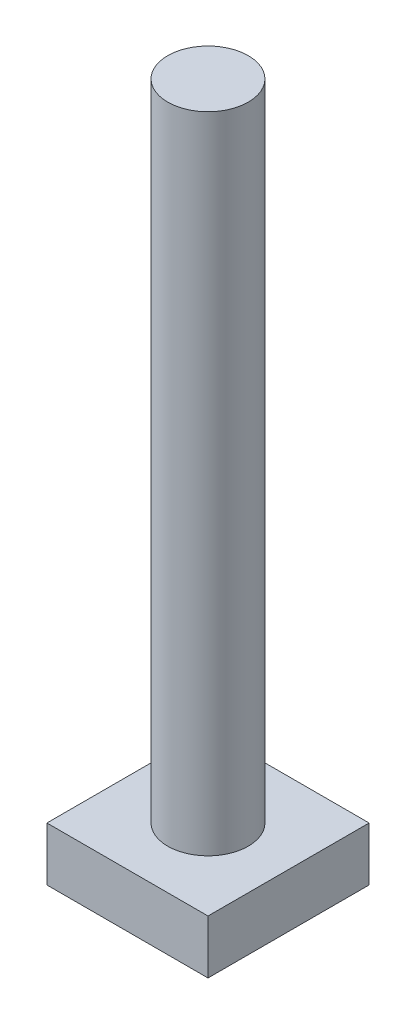
ISO-10303-21;
HEADER;
FILE_DESCRIPTION(('STEP AP214'),'2;1');
FILE_NAME('part.step','',(''),(''),'','','');
FILE_SCHEMA(('AUTOMOTIVE_DESIGN { 1 0 10303 214 1 1 1 1 }'));
ENDSEC;
DATA;
#1=APPLICATION_CONTEXT('core data for automotive mechanical design processes');
#2=APPLICATION_PROTOCOL_DEFINITION('international standard','automotive_design',2000,#1);
#3=PRODUCT_CONTEXT('',#1,'mechanical');
#4=PRODUCT('Part','Part','',(#3));
#5=PRODUCT_RELATED_PRODUCT_CATEGORY('part','',(#4));
#6=PRODUCT_DEFINITION_FORMATION('','',#4);
#7=PRODUCT_DEFINITION_CONTEXT('part definition',#1,'design');
#8=PRODUCT_DEFINITION('design','',#6,#7);
#9=PRODUCT_DEFINITION_SHAPE('','',#8);
#10=(LENGTH_UNIT() NAMED_UNIT(*) SI_UNIT(.MILLI.,.METRE.));
#11=(NAMED_UNIT(*) PLANE_ANGLE_UNIT() SI_UNIT($,.RADIAN.));
#12=(NAMED_UNIT(*) SI_UNIT($,.STERADIAN.) SOLID_ANGLE_UNIT());
#13=UNCERTAINTY_MEASURE_WITH_UNIT(LENGTH_MEASURE(1.E-05),#10,'distance_accuracy_value','');
#14=(GEOMETRIC_REPRESENTATION_CONTEXT(3) GLOBAL_UNCERTAINTY_ASSIGNED_CONTEXT((#13)) GLOBAL_UNIT_ASSIGNED_CONTEXT((#10,
#11,#12)) REPRESENTATION_CONTEXT('',''));
#15=CARTESIAN_POINT('',(0.,0.,0.));
#16=DIRECTION('',(0.,0.,1.));
#17=DIRECTION('',(1.,0.,0.));
#18=AXIS2_PLACEMENT_3D('',#15,#16,#17);
#19=CARTESIAN_POINT('',(12.,4.,-12.));
#20=DIRECTION('',(-1.,0.,0.));
#21=DIRECTION('',(0.,0.,1.));
#22=AXIS2_PLACEMENT_3D('',#19,#20,#21);
#23=PLANE('',#22);
#24=DIRECTION('',(0.,0.,-1.));
#25=VECTOR('',#24,1.);
#26=CARTESIAN_POINT('',(12.,-4.,-12.));
#27=LINE('',#26,#25);
#28=CARTESIAN_POINT('',(12.,-4.,12.));
#29=VERTEX_POINT('',#28);
#30=CARTESIAN_POINT('',(12.,-4.,-12.));
#31=VERTEX_POINT('',#30);
#32=EDGE_CURVE('E103',#29,#31,#27,.T.);
#33=ORIENTED_EDGE('',*,*,#32,.T.);
#34=DIRECTION('',(0.,-1.,0.));
#35=VECTOR('',#34,1.);
#36=CARTESIAN_POINT('',(12.,4.,-12.));
#37=LINE('',#36,#35);
#38=CARTESIAN_POINT('',(12.,4.,-12.));
#39=VERTEX_POINT('',#38);
#40=EDGE_CURVE('E40',#39,#31,#37,.T.);
#41=ORIENTED_EDGE('',*,*,#40,.F.);
#42=DIRECTION('',(0.,0.,-1.));
#43=VECTOR('',#42,1.);
#44=CARTESIAN_POINT('',(12.,4.,-12.));
#45=LINE('',#44,#43);
#46=CARTESIAN_POINT('',(12.,4.,12.));
#47=VERTEX_POINT('',#46);
#48=EDGE_CURVE('E90',#47,#39,#45,.T.);
#49=ORIENTED_EDGE('',*,*,#48,.F.);
#50=DIRECTION('',(0.,-1.,0.));
#51=VECTOR('',#50,1.);
#52=CARTESIAN_POINT('',(12.,4.,12.));
#53=LINE('',#52,#51);
#54=EDGE_CURVE('E99',#47,#29,#53,.T.);
#55=ORIENTED_EDGE('',*,*,#54,.T.);
#56=EDGE_LOOP('',(#33,#41,#49,#55));
#57=FACE_BOUND('',#56,.T.);
#58=ADVANCED_FACE('F37',(#57),#23,.F.);
#59=CARTESIAN_POINT('',(-12.,4.,-12.));
#60=DIRECTION('',(0.,0.,1.));
#61=DIRECTION('',(1.,0.,0.));
#62=AXIS2_PLACEMENT_3D('',#59,#60,#61);
#63=PLANE('',#62);
#64=DIRECTION('',(-1.,0.,0.));
#65=VECTOR('',#64,1.);
#66=CARTESIAN_POINT('',(-12.,-4.,-12.));
#67=LINE('',#66,#65);
#68=CARTESIAN_POINT('',(-12.,-4.,-12.));
#69=VERTEX_POINT('',#68);
#70=EDGE_CURVE('E95',#31,#69,#67,.T.);
#71=ORIENTED_EDGE('',*,*,#70,.T.);
#72=DIRECTION('',(0.,-1.,0.));
#73=VECTOR('',#72,1.);
#74=CARTESIAN_POINT('',(-12.,4.,-12.));
#75=LINE('',#74,#73);
#76=CARTESIAN_POINT('',(-12.,4.,-12.));
#77=VERTEX_POINT('',#76);
#78=EDGE_CURVE('E93',#77,#69,#75,.T.);
#79=ORIENTED_EDGE('',*,*,#78,.F.);
#80=DIRECTION('',(-1.,0.,0.));
#81=VECTOR('',#80,1.);
#82=CARTESIAN_POINT('',(-12.,4.,-12.));
#83=LINE('',#82,#81);
#84=EDGE_CURVE('E85',#39,#77,#83,.T.);
#85=ORIENTED_EDGE('',*,*,#84,.F.);
#86=ORIENTED_EDGE('',*,*,#40,.T.);
#87=EDGE_LOOP('',(#71,#79,#85,#86));
#88=FACE_BOUND('',#87,.T.);
#89=ADVANCED_FACE('F94',(#88),#63,.F.);
#90=CARTESIAN_POINT('',(-12.,4.,-12.));
#91=DIRECTION('',(1.,0.,0.));
#92=DIRECTION('',(0.,0.,-1.));
#93=AXIS2_PLACEMENT_3D('',#90,#91,#92);
#94=PLANE('',#93);
#95=DIRECTION('',(0.,0.,1.));
#96=VECTOR('',#95,1.);
#97=CARTESIAN_POINT('',(-12.,-4.,-12.));
#98=LINE('',#97,#96);
#99=CARTESIAN_POINT('',(-12.,-4.,12.));
#100=VERTEX_POINT('',#99);
#101=EDGE_CURVE('E71',#69,#100,#98,.T.);
#102=ORIENTED_EDGE('',*,*,#101,.T.);
#103=DIRECTION('',(0.,-1.,0.));
#104=VECTOR('',#103,1.);
#105=CARTESIAN_POINT('',(-12.,4.,12.));
#106=LINE('',#105,#104);
#107=CARTESIAN_POINT('',(-12.,4.,12.));
#108=VERTEX_POINT('',#107);
#109=EDGE_CURVE('E96',#108,#100,#106,.T.);
#110=ORIENTED_EDGE('',*,*,#109,.F.);
#111=DIRECTION('',(0.,0.,1.));
#112=VECTOR('',#111,1.);
#113=CARTESIAN_POINT('',(-12.,4.,-12.));
#114=LINE('',#113,#112);
#115=EDGE_CURVE('E88',#77,#108,#114,.T.);
#116=ORIENTED_EDGE('',*,*,#115,.F.);
#117=ORIENTED_EDGE('',*,*,#78,.T.);
#118=EDGE_LOOP('',(#102,#110,#116,#117));
#119=FACE_BOUND('',#118,.T.);
#120=ADVANCED_FACE('F97',(#119),#94,.F.);
#121=CARTESIAN_POINT('',(-12.,4.,12.));
#122=DIRECTION('',(0.,0.,-1.));
#123=DIRECTION('',(-1.,0.,0.));
#124=AXIS2_PLACEMENT_3D('',#121,#122,#123);
#125=PLANE('',#124);
#126=DIRECTION('',(1.,0.,0.));
#127=VECTOR('',#126,1.);
#128=CARTESIAN_POINT('',(-12.,-4.,12.));
#129=LINE('',#128,#127);
#130=EDGE_CURVE('E77',#100,#29,#129,.T.);
#131=ORIENTED_EDGE('',*,*,#130,.T.);
#132=ORIENTED_EDGE('',*,*,#54,.F.);
#133=DIRECTION('',(1.,0.,0.));
#134=VECTOR('',#133,1.);
#135=CARTESIAN_POINT('',(-12.,4.,12.));
#136=LINE('',#135,#134);
#137=EDGE_CURVE('E54',#108,#47,#136,.T.);
#138=ORIENTED_EDGE('',*,*,#137,.F.);
#139=ORIENTED_EDGE('',*,*,#109,.T.);
#140=EDGE_LOOP('',(#131,#132,#138,#139));
#141=FACE_BOUND('',#140,.T.);
#142=ADVANCED_FACE('F111',(#141),#125,.F.);
#143=CARTESIAN_POINT('',(0.,4.,0.));
#144=DIRECTION('',(0.,1.,0.));
#145=DIRECTION('',(0.,0.,1.));
#146=AXIS2_PLACEMENT_3D('',#143,#144,#145);
#147=PLANE('',#146);
#148=CARTESIAN_POINT('',(0.,4.,0.));
#149=DIRECTION('',(0.,1.,0.));
#150=DIRECTION('',(0.,0.,1.));
#151=AXIS2_PLACEMENT_3D('',#148,#149,#150);
#152=CIRCLE('',#151,6.);
#153=CARTESIAN_POINT('',(0.,4.,6.));
#154=VERTEX_POINT('',#153);
#155=EDGE_CURVE('E11',#154,#154,#152,.T.);
#156=ORIENTED_EDGE('',*,*,#155,.F.);
#157=EDGE_LOOP('',(#156));
#158=FACE_BOUND('',#157,.T.);
#159=ORIENTED_EDGE('',*,*,#48,.T.);
#160=ORIENTED_EDGE('',*,*,#84,.T.);
#161=ORIENTED_EDGE('',*,*,#115,.T.);
#162=ORIENTED_EDGE('',*,*,#137,.T.);
#163=EDGE_LOOP('',(#159,#160,#161,#162));
#164=FACE_BOUND('',#163,.T.);
#165=ADVANCED_FACE('F86',(#158,#164),#147,.T.);
#166=CARTESIAN_POINT('',(0.,-4.,0.));
#167=DIRECTION('',(0.,1.,0.));
#168=DIRECTION('',(0.,0.,1.));
#169=AXIS2_PLACEMENT_3D('',#166,#167,#168);
#170=PLANE('',#169);
#171=ORIENTED_EDGE('',*,*,#32,.F.);
#172=ORIENTED_EDGE('',*,*,#130,.F.);
#173=ORIENTED_EDGE('',*,*,#101,.F.);
#174=ORIENTED_EDGE('',*,*,#70,.F.);
#175=EDGE_LOOP('',(#171,#172,#173,#174));
#176=FACE_BOUND('',#175,.T.);
#177=ADVANCED_FACE('F114',(#176),#170,.F.);
#178=CARTESIAN_POINT('',(0.,100.,0.));
#179=DIRECTION('',(0.,-1.,0.));
#180=DIRECTION('',(0.,0.,-1.));
#181=AXIS2_PLACEMENT_3D('',#178,#179,#180);
#182=CYLINDRICAL_SURFACE('',#181,6.);
#183=CARTESIAN_POINT('',(0.,100.,0.));
#184=DIRECTION('',(0.,1.,0.));
#185=DIRECTION('',(0.,0.,1.));
#186=AXIS2_PLACEMENT_3D('',#183,#184,#185);
#187=CIRCLE('',#186,6.);
#188=CARTESIAN_POINT('',(0.,100.,6.));
#189=VERTEX_POINT('',#188);
#190=EDGE_CURVE('E106',#189,#189,#187,.T.);
#191=ORIENTED_EDGE('',*,*,#190,.F.);
#192=EDGE_LOOP('',(#191));
#193=FACE_BOUND('',#192,.T.);
#194=ORIENTED_EDGE('',*,*,#155,.T.);
#195=EDGE_LOOP('',(#194));
#196=FACE_BOUND('',#195,.T.);
#197=ADVANCED_FACE('F122',(#193,#196),#182,.T.);
#198=CARTESIAN_POINT('',(0.,100.,0.));
#199=DIRECTION('',(0.,1.,0.));
#200=DIRECTION('',(0.,0.,1.));
#201=AXIS2_PLACEMENT_3D('',#198,#199,#200);
#202=PLANE('',#201);
#203=ORIENTED_EDGE('',*,*,#190,.T.);
#204=EDGE_LOOP('',(#203));
#205=FACE_BOUND('',#204,.T.);
#206=ADVANCED_FACE('F120',(#205),#202,.T.);
#207=CLOSED_SHELL('',(#58,#89,#120,#142,#165,#177,#197,#206));
#208=MANIFOLD_SOLID_BREP('B2',#207);
#209=ADVANCED_BREP_SHAPE_REPRESENTATION('',(#18,#208),#14);
#210=SHAPE_DEFINITION_REPRESENTATION(#9,#209);
ENDSEC;
END-ISO-10303-21;
